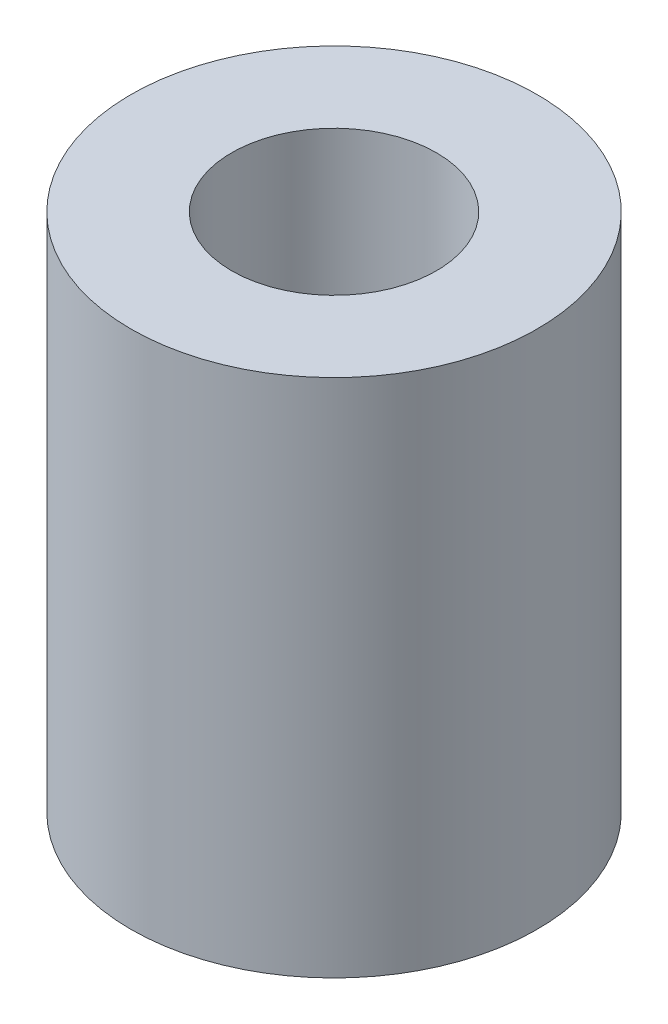
ISO-10303-21;
HEADER;
FILE_DESCRIPTION(('STEP AP214'),'2;1');
FILE_NAME('part.step','',(''),(''),'','','');
FILE_SCHEMA(('AUTOMOTIVE_DESIGN { 1 0 10303 214 1 1 1 1 }'));
ENDSEC;
DATA;
#1=APPLICATION_CONTEXT('core data for automotive mechanical design processes');
#2=APPLICATION_PROTOCOL_DEFINITION('international standard','automotive_design',2000,#1);
#3=PRODUCT_CONTEXT('',#1,'mechanical');
#4=PRODUCT('Part','Part','',(#3));
#5=PRODUCT_RELATED_PRODUCT_CATEGORY('part','',(#4));
#6=PRODUCT_DEFINITION_FORMATION('','',#4);
#7=PRODUCT_DEFINITION_CONTEXT('part definition',#1,'design');
#8=PRODUCT_DEFINITION('design','',#6,#7);
#9=PRODUCT_DEFINITION_SHAPE('','',#8);
#10=(LENGTH_UNIT() NAMED_UNIT(*) SI_UNIT(.MILLI.,.METRE.));
#11=(NAMED_UNIT(*) PLANE_ANGLE_UNIT() SI_UNIT($,.RADIAN.));
#12=(NAMED_UNIT(*) SI_UNIT($,.STERADIAN.) SOLID_ANGLE_UNIT());
#13=UNCERTAINTY_MEASURE_WITH_UNIT(LENGTH_MEASURE(1.E-05),#10,'distance_accuracy_value','');
#14=(GEOMETRIC_REPRESENTATION_CONTEXT(3) GLOBAL_UNCERTAINTY_ASSIGNED_CONTEXT((#13)) GLOBAL_UNIT_ASSIGNED_CONTEXT((#10,
#11,#12)) REPRESENTATION_CONTEXT('',''));
#15=CARTESIAN_POINT('',(0.,0.,0.));
#16=DIRECTION('',(0.,0.,1.));
#17=DIRECTION('',(1.,0.,0.));
#18=AXIS2_PLACEMENT_3D('',#15,#16,#17);
#19=CARTESIAN_POINT('',(0.,20.32,0.));
#20=DIRECTION('',(0.,-1.,0.));
#21=DIRECTION('',(0.,0.,-1.));
#22=AXIS2_PLACEMENT_3D('',#19,#20,#21);
#23=CYLINDRICAL_SURFACE('',#22,7.9375);
#24=CARTESIAN_POINT('',(0.,20.32,0.));
#25=DIRECTION('',(0.,1.,0.));
#26=DIRECTION('',(0.,0.,1.));
#27=AXIS2_PLACEMENT_3D('',#24,#25,#26);
#28=CIRCLE('',#27,7.9375);
#29=CARTESIAN_POINT('',(0.,20.32,7.9375));
#30=VERTEX_POINT('',#29);
#31=EDGE_CURVE('E10',#30,#30,#28,.T.);
#32=ORIENTED_EDGE('',*,*,#31,.F.);
#33=EDGE_LOOP('',(#32));
#34=FACE_BOUND('',#33,.T.);
#35=CARTESIAN_POINT('',(0.,0.,0.));
#36=DIRECTION('',(0.,1.,0.));
#37=DIRECTION('',(0.,0.,1.));
#38=AXIS2_PLACEMENT_3D('',#35,#36,#37);
#39=CIRCLE('',#38,7.9375);
#40=CARTESIAN_POINT('',(0.,0.,7.9375));
#41=VERTEX_POINT('',#40);
#42=EDGE_CURVE('E40',#41,#41,#39,.T.);
#43=ORIENTED_EDGE('',*,*,#42,.T.);
#44=EDGE_LOOP('',(#43));
#45=FACE_BOUND('',#44,.T.);
#46=ADVANCED_FACE('F37',(#34,#45),#23,.T.);
#47=CARTESIAN_POINT('',(0.,20.32,0.));
#48=DIRECTION('',(0.,1.,0.));
#49=DIRECTION('',(0.,0.,1.));
#50=AXIS2_PLACEMENT_3D('',#47,#48,#49);
#51=PLANE('',#50);
#52=CARTESIAN_POINT('',(0.,20.32,0.));
#53=DIRECTION('',(0.,1.,0.));
#54=DIRECTION('',(0.,0.,1.));
#55=AXIS2_PLACEMENT_3D('',#52,#53,#54);
#56=CIRCLE('',#55,4.);
#57=CARTESIAN_POINT('',(0.,20.32,4.));
#58=VERTEX_POINT('',#57);
#59=EDGE_CURVE('E49',#58,#58,#56,.T.);
#60=ORIENTED_EDGE('',*,*,#59,.F.);
#61=EDGE_LOOP('',(#60));
#62=FACE_BOUND('',#61,.T.);
#63=ORIENTED_EDGE('',*,*,#31,.T.);
#64=EDGE_LOOP('',(#63));
#65=FACE_BOUND('',#64,.T.);
#66=ADVANCED_FACE('F64',(#62,#65),#51,.T.);
#67=CARTESIAN_POINT('',(0.,0.,0.));
#68=DIRECTION('',(0.,1.,0.));
#69=DIRECTION('',(0.,0.,1.));
#70=AXIS2_PLACEMENT_3D('',#67,#68,#69);
#71=PLANE('',#70);
#72=CARTESIAN_POINT('',(0.,0.,0.));
#73=DIRECTION('',(0.,1.,0.));
#74=DIRECTION('',(0.,0.,1.));
#75=AXIS2_PLACEMENT_3D('',#72,#73,#74);
#76=CIRCLE('',#75,4.);
#77=CARTESIAN_POINT('',(0.,0.,4.));
#78=VERTEX_POINT('',#77);
#79=EDGE_CURVE('E47',#78,#78,#76,.T.);
#80=ORIENTED_EDGE('',*,*,#79,.T.);
#81=EDGE_LOOP('',(#80));
#82=FACE_BOUND('',#81,.T.);
#83=ORIENTED_EDGE('',*,*,#42,.F.);
#84=EDGE_LOOP('',(#83));
#85=FACE_BOUND('',#84,.T.);
#86=ADVANCED_FACE('F55',(#82,#85),#71,.F.);
#87=CARTESIAN_POINT('',(0.,0.,0.));
#88=DIRECTION('',(0.,1.,0.));
#89=DIRECTION('',(0.,0.,1.));
#90=AXIS2_PLACEMENT_3D('',#87,#88,#89);
#91=CYLINDRICAL_SURFACE('',#90,4.);
#92=ORIENTED_EDGE('',*,*,#79,.F.);
#93=EDGE_LOOP('',(#92));
#94=FACE_BOUND('',#93,.T.);
#95=ORIENTED_EDGE('',*,*,#59,.T.);
#96=EDGE_LOOP('',(#95));
#97=FACE_BOUND('',#96,.T.);
#98=ADVANCED_FACE('F58',(#94,#97),#91,.F.);
#99=CLOSED_SHELL('',(#46,#66,#86,#98));
#100=MANIFOLD_SOLID_BREP('B2',#99);
#101=ADVANCED_BREP_SHAPE_REPRESENTATION('',(#18,#100),#14);
#102=SHAPE_DEFINITION_REPRESENTATION(#9,#101);
ENDSEC;
END-ISO-10303-21;
